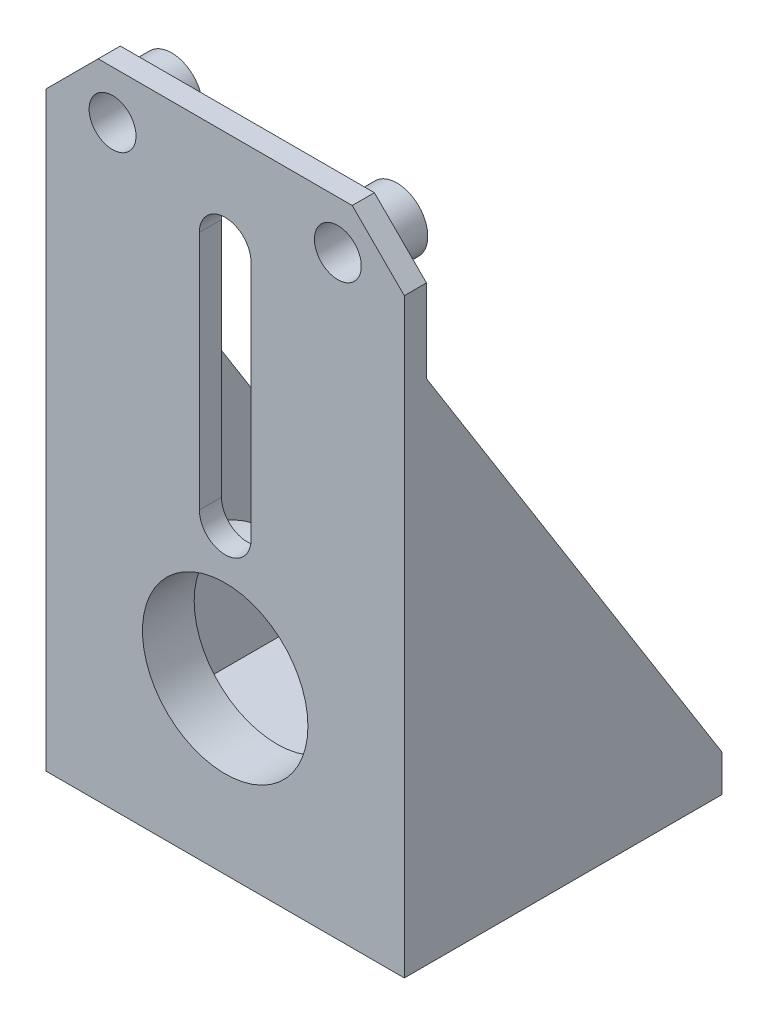
ISO-10303-21;
HEADER;
FILE_DESCRIPTION(('STEP AP214'),'2;1');
FILE_NAME('part.step','',(''),(''),'','','');
FILE_SCHEMA(('AUTOMOTIVE_DESIGN { 1 0 10303 214 1 1 1 1 }'));
ENDSEC;
DATA;
#1=APPLICATION_CONTEXT('core data for automotive mechanical design processes');
#2=APPLICATION_PROTOCOL_DEFINITION('international standard','automotive_design',2000,#1);
#3=PRODUCT_CONTEXT('',#1,'mechanical');
#4=PRODUCT('Part','Part','',(#3));
#5=PRODUCT_RELATED_PRODUCT_CATEGORY('part','',(#4));
#6=PRODUCT_DEFINITION_FORMATION('','',#4);
#7=PRODUCT_DEFINITION_CONTEXT('part definition',#1,'design');
#8=PRODUCT_DEFINITION('design','',#6,#7);
#9=PRODUCT_DEFINITION_SHAPE('','',#8);
#10=(LENGTH_UNIT() NAMED_UNIT(*) SI_UNIT(.MILLI.,.METRE.));
#11=(NAMED_UNIT(*) PLANE_ANGLE_UNIT() SI_UNIT($,.RADIAN.));
#12=(NAMED_UNIT(*) SI_UNIT($,.STERADIAN.) SOLID_ANGLE_UNIT());
#13=UNCERTAINTY_MEASURE_WITH_UNIT(LENGTH_MEASURE(1.E-05),#10,'distance_accuracy_value','');
#14=(GEOMETRIC_REPRESENTATION_CONTEXT(3) GLOBAL_UNCERTAINTY_ASSIGNED_CONTEXT((#13)) GLOBAL_UNIT_ASSIGNED_CONTEXT((#10,
#11,#12)) REPRESENTATION_CONTEXT('',''));
#15=CARTESIAN_POINT('',(0.,0.,0.));
#16=DIRECTION('',(0.,0.,1.));
#17=DIRECTION('',(1.,0.,0.));
#18=AXIS2_PLACEMENT_3D('',#15,#16,#17);
#19=CARTESIAN_POINT('',(0.,0.,0.));
#20=DIRECTION('',(0.,0.,-1.));
#21=DIRECTION('',(-1.,0.,0.));
#22=AXIS2_PLACEMENT_3D('',#19,#20,#21);
#23=PLANE('',#22);
#24=DIRECTION('',(0.,-1.,0.));
#25=VECTOR('',#24,1.);
#26=CARTESIAN_POINT('',(-36.4212863458922,72.55,0.));
#27=LINE('',#26,#25);
#28=CARTESIAN_POINT('',(-36.4212863458922,70.9996172150046,0.));
#29=VERTEX_POINT('',#28);
#30=CARTESIAN_POINT('',(-36.4212863458922,59.7674418604651,0.));
#31=VERTEX_POINT('',#30);
#32=EDGE_CURVE('E163',#29,#31,#27,.T.);
#33=ORIENTED_EDGE('',*,*,#32,.F.);
#34=DIRECTION('',(0.707106781186546,0.707106781186549,0.));
#35=VECTOR('',#34,1.);
#36=CARTESIAN_POINT('',(-53.7104517804485,53.7104517804483,0.));
#37=LINE('',#36,#35);
#38=CARTESIAN_POINT('',(-29.3709035608969,78.05,0.));
#39=VERTEX_POINT('',#38);
#40=EDGE_CURVE('E173',#29,#39,#37,.T.);
#41=ORIENTED_EDGE('',*,*,#40,.T.);
#42=DIRECTION('',(1.,0.,0.));
#43=VECTOR('',#42,1.);
#44=CARTESIAN_POINT('',(0.,78.05,0.));
#45=LINE('',#44,#43);
#46=CARTESIAN_POINT('',(5.02833086911244,78.05,0.));
#47=VERTEX_POINT('',#46);
#48=EDGE_CURVE('E177',#39,#47,#45,.T.);
#49=ORIENTED_EDGE('',*,*,#48,.T.);
#50=DIRECTION('',(-0.707106781186546,0.707106781186549,0.));
#51=VECTOR('',#50,1.);
#52=CARTESIAN_POINT('',(41.5391654345562,41.5391654345561,0.));
#53=LINE('',#52,#51);
#54=CARTESIAN_POINT('',(12.0787136541078,70.9996172150046,0.));
#55=VERTEX_POINT('',#54);
#56=EDGE_CURVE('E169',#55,#47,#53,.T.);
#57=ORIENTED_EDGE('',*,*,#56,.F.);
#58=DIRECTION('',(0.,1.,0.));
#59=VECTOR('',#58,1.);
#60=CARTESIAN_POINT('',(12.0787136541078,72.5556248805126,0.));
#61=LINE('',#60,#59);
#62=CARTESIAN_POINT('',(12.0787136541078,59.7674418604652,0.));
#63=VERTEX_POINT('',#62);
#64=EDGE_CURVE('E153',#63,#55,#61,.T.);
#65=ORIENTED_EDGE('',*,*,#64,.F.);
#66=DIRECTION('',(1.,0.,0.));
#67=VECTOR('',#66,1.);
#68=CARTESIAN_POINT('',(0.,59.7674418604651,0.));
#69=LINE('',#68,#67);
#70=CARTESIAN_POINT('',(9.07871365410777,59.7674418604651,0.));
#71=VERTEX_POINT('',#70);
#72=EDGE_CURVE('E164',#71,#63,#69,.T.);
#73=ORIENTED_EDGE('',*,*,#72,.F.);
#74=DIRECTION('',(0.,-1.,0.));
#75=VECTOR('',#74,1.);
#76=CARTESIAN_POINT('',(9.07871365410777,48.0313996107964,0.));
#77=LINE('',#76,#75);
#78=CARTESIAN_POINT('',(9.07871365410777,-6.00000000000001,0.));
#79=VERTEX_POINT('',#78);
#80=EDGE_CURVE('E285',#71,#79,#77,.T.);
#81=ORIENTED_EDGE('',*,*,#80,.T.);
#82=DIRECTION('',(1.,0.,0.));
#83=VECTOR('',#82,1.);
#84=CARTESIAN_POINT('',(9.07871365410777,-6.00000000000001,0.));
#85=LINE('',#84,#83);
#86=CARTESIAN_POINT('',(-33.4212863458922,-6.00000000000001,0.));
#87=VERTEX_POINT('',#86);
#88=EDGE_CURVE('E283',#87,#79,#85,.T.);
#89=ORIENTED_EDGE('',*,*,#88,.F.);
#90=DIRECTION('',(0.,1.,0.));
#91=VECTOR('',#90,1.);
#92=CARTESIAN_POINT('',(-33.4212863458922,48.0313996107964,0.));
#93=LINE('',#92,#91);
#94=CARTESIAN_POINT('',(-33.4212863458922,59.7674418604651,0.));
#95=VERTEX_POINT('',#94);
#96=EDGE_CURVE('E255',#87,#95,#93,.T.);
#97=ORIENTED_EDGE('',*,*,#96,.T.);
#98=DIRECTION('',(1.,0.,0.));
#99=VECTOR('',#98,1.);
#100=CARTESIAN_POINT('',(0.,59.7674418604651,0.));
#101=LINE('',#100,#99);
#102=EDGE_CURVE('E202',#31,#95,#101,.T.);
#103=ORIENTED_EDGE('',*,*,#102,.F.);
#104=EDGE_LOOP('',(#33,#41,#49,#57,#65,#73,#81,#89,#97,#103));
#105=FACE_BOUND('',#104,.T.);
#106=CARTESIAN_POINT('',(-27.4212863458922,71.55,0.));
#107=DIRECTION('',(0.,0.,-1.));
#108=DIRECTION('',(-1.,0.,0.));
#109=AXIS2_PLACEMENT_3D('',#106,#107,#108);
#110=CIRCLE('',#109,4.175);
#111=CARTESIAN_POINT('',(-31.5962863458922,71.55,0.));
#112=VERTEX_POINT('',#111);
#113=EDGE_CURVE('E269',#112,#112,#110,.T.);
#114=ORIENTED_EDGE('',*,*,#113,.F.);
#115=EDGE_LOOP('',(#114));
#116=FACE_BOUND('',#115,.T.);
#117=CARTESIAN_POINT('',(3.07871365410777,71.55,0.));
#118=DIRECTION('',(0.,0.,-1.));
#119=DIRECTION('',(-1.,0.,0.));
#120=AXIS2_PLACEMENT_3D('',#117,#118,#119);
#121=CIRCLE('',#120,4.175);
#122=CARTESIAN_POINT('',(-1.09628634589223,71.55,0.));
#123=VERTEX_POINT('',#122);
#124=EDGE_CURVE('E272',#123,#123,#121,.T.);
#125=ORIENTED_EDGE('',*,*,#124,.F.);
#126=EDGE_LOOP('',(#125));
#127=FACE_BOUND('',#126,.T.);
#128=CARTESIAN_POINT('',(-12.1712863458922,64.55,0.));
#129=DIRECTION('',(0.,0.,-1.));
#130=DIRECTION('',(-1.,0.,0.));
#131=AXIS2_PLACEMENT_3D('',#128,#129,#130);
#132=CIRCLE('',#131,3.5);
#133=CARTESIAN_POINT('',(-15.6712863458922,64.55,0.));
#134=VERTEX_POINT('',#133);
#135=CARTESIAN_POINT('',(-8.67128634589223,64.55,0.));
#136=VERTEX_POINT('',#135);
#137=EDGE_CURVE('E250',#134,#136,#132,.T.);
#138=ORIENTED_EDGE('',*,*,#137,.F.);
#139=DIRECTION('',(0.,1.,0.));
#140=VECTOR('',#139,1.);
#141=CARTESIAN_POINT('',(-15.6712863458922,0.,0.));
#142=LINE('',#141,#140);
#143=CARTESIAN_POINT('',(-15.6712863458922,32.,0.));
#144=VERTEX_POINT('',#143);
#145=EDGE_CURVE('E240',#144,#134,#142,.T.);
#146=ORIENTED_EDGE('',*,*,#145,.F.);
#147=CARTESIAN_POINT('',(-12.1712863458922,32.,0.));
#148=DIRECTION('',(0.,0.,-1.));
#149=DIRECTION('',(-1.,0.,0.));
#150=AXIS2_PLACEMENT_3D('',#147,#148,#149);
#151=CIRCLE('',#150,3.5);
#152=CARTESIAN_POINT('',(-8.67128634589223,32.,0.));
#153=VERTEX_POINT('',#152);
#154=EDGE_CURVE('E246',#153,#144,#151,.T.);
#155=ORIENTED_EDGE('',*,*,#154,.F.);
#156=DIRECTION('',(0.,-1.,0.));
#157=VECTOR('',#156,1.);
#158=CARTESIAN_POINT('',(-8.67128634589223,0.,0.));
#159=LINE('',#158,#157);
#160=EDGE_CURVE('E248',#136,#153,#159,.T.);
#161=ORIENTED_EDGE('',*,*,#160,.F.);
#162=EDGE_LOOP('',(#138,#146,#155,#161));
#163=FACE_BOUND('',#162,.T.);
#164=CARTESIAN_POINT('',(-12.1712863458922,14.,0.));
#165=DIRECTION('',(0.,0.,-1.));
#166=DIRECTION('',(-1.,0.,0.));
#167=AXIS2_PLACEMENT_3D('',#164,#165,#166);
#168=CIRCLE('',#167,13.5);
#169=CARTESIAN_POINT('',(-25.6712863458922,14.,0.));
#170=VERTEX_POINT('',#169);
#171=EDGE_CURVE('E222',#170,#170,#168,.T.);
#172=ORIENTED_EDGE('',*,*,#171,.F.);
#173=EDGE_LOOP('',(#172));
#174=FACE_BOUND('',#173,.T.);
#175=ADVANCED_FACE('F37',(#105,#116,#127,#163,#174),#23,.T.);
#176=CARTESIAN_POINT('',(-36.2590086857239,-9.00000000000001,3.));
#177=DIRECTION('',(0.,-1.,0.));
#178=DIRECTION('',(0.,0.,-1.));
#179=AXIS2_PLACEMENT_3D('',#176,#177,#178);
#180=PLANE('',#179);
#181=DIRECTION('',(-1.,0.,0.));
#182=VECTOR('',#181,1.);
#183=CARTESIAN_POINT('',(12.0787136541078,-9.00000000000001,3.));
#184=LINE('',#183,#182);
#185=CARTESIAN_POINT('',(12.0787136541078,-9.00000000000001,3.));
#186=VERTEX_POINT('',#185);
#187=CARTESIAN_POINT('',(-36.4212863458922,-9.00000000000001,3.));
#188=VERTEX_POINT('',#187);
#189=EDGE_CURVE('E306',#186,#188,#184,.T.);
#190=ORIENTED_EDGE('',*,*,#189,.T.);
#191=DIRECTION('',(0.,0.,1.));
#192=VECTOR('',#191,1.);
#193=CARTESIAN_POINT('',(-36.4212863458922,-9.00000000000001,-40.));
#194=LINE('',#193,#192);
#195=CARTESIAN_POINT('',(-36.4212863458922,-9.00000000000001,-40.));
#196=VERTEX_POINT('',#195);
#197=EDGE_CURVE('E203',#196,#188,#194,.T.);
#198=ORIENTED_EDGE('',*,*,#197,.F.);
#199=DIRECTION('',(-1.,0.,0.));
#200=VECTOR('',#199,1.);
#201=CARTESIAN_POINT('',(12.0787136541078,-9.00000000000001,-40.));
#202=LINE('',#201,#200);
#203=CARTESIAN_POINT('',(12.0787136541078,-9.00000000000001,-40.));
#204=VERTEX_POINT('',#203);
#205=EDGE_CURVE('E299',#204,#196,#202,.T.);
#206=ORIENTED_EDGE('',*,*,#205,.F.);
#207=DIRECTION('',(0.,0.,-1.));
#208=VECTOR('',#207,1.);
#209=CARTESIAN_POINT('',(12.0787136541078,-9.00000000000001,3.));
#210=LINE('',#209,#208);
#211=EDGE_CURVE('E11',#186,#204,#210,.T.);
#212=ORIENTED_EDGE('',*,*,#211,.F.);
#213=EDGE_LOOP('',(#190,#198,#206,#212));
#214=FACE_BOUND('',#213,.T.);
#215=ADVANCED_FACE('F333',(#214),#180,.T.);
#216=CARTESIAN_POINT('',(12.0787136541078,-4.00000000000001,3.));
#217=DIRECTION('',(1.,0.,0.));
#218=DIRECTION('',(0.,0.,-1.));
#219=AXIS2_PLACEMENT_3D('',#216,#217,#218);
#220=PLANE('',#219);
#221=ORIENTED_EDGE('',*,*,#64,.T.);
#222=DIRECTION('',(0.,0.,1.));
#223=VECTOR('',#222,1.);
#224=CARTESIAN_POINT('',(12.0787136541078,70.9996172150046,0.));
#225=LINE('',#224,#223);
#226=CARTESIAN_POINT('',(12.0787136541078,70.9996172150046,3.));
#227=VERTEX_POINT('',#226);
#228=EDGE_CURVE('E156',#55,#227,#225,.T.);
#229=ORIENTED_EDGE('',*,*,#228,.T.);
#230=DIRECTION('',(0.,-1.,0.));
#231=VECTOR('',#230,1.);
#232=CARTESIAN_POINT('',(12.0787136541078,-4.00000000000001,3.));
#233=LINE('',#232,#231);
#234=EDGE_CURVE('E304',#227,#186,#233,.T.);
#235=ORIENTED_EDGE('',*,*,#234,.T.);
#236=ORIENTED_EDGE('',*,*,#211,.T.);
#237=DIRECTION('',(0.,-1.,0.));
#238=VECTOR('',#237,1.);
#239=CARTESIAN_POINT('',(12.0787136541078,-4.00000000000001,-40.));
#240=LINE('',#239,#238);
#241=CARTESIAN_POINT('',(12.0787136541078,-4.00000000000001,-40.));
#242=VERTEX_POINT('',#241);
#243=EDGE_CURVE('E296',#242,#204,#240,.T.);
#244=ORIENTED_EDGE('',*,*,#243,.F.);
#245=DIRECTION('',(0.,0.847129341977914,0.531386749891325));
#246=VECTOR('',#245,1.);
#247=CARTESIAN_POINT('',(12.0787136541078,-4.00000000000001,-40.));
#248=LINE('',#247,#246);
#249=EDGE_CURVE('E159',#242,#63,#248,.T.);
#250=ORIENTED_EDGE('',*,*,#249,.T.);
#251=EDGE_LOOP('',(#221,#229,#235,#236,#244,#250));
#252=FACE_BOUND('',#251,.T.);
#253=ADVANCED_FACE('F155',(#252),#220,.T.);
#254=CARTESIAN_POINT('',(9.07871365410777,-6.00000000000001,3.));
#255=DIRECTION('',(-1.,0.,0.));
#256=DIRECTION('',(0.,0.,1.));
#257=AXIS2_PLACEMENT_3D('',#254,#255,#256);
#258=PLANE('',#257);
#259=DIRECTION('',(0.,0.,-1.));
#260=VECTOR('',#259,1.);
#261=CARTESIAN_POINT('',(9.07871365410777,-6.00000000000001,3.));
#262=LINE('',#261,#260);
#263=CARTESIAN_POINT('',(9.07871365410777,-6.00000000000001,-40.));
#264=VERTEX_POINT('',#263);
#265=EDGE_CURVE('E46',#79,#264,#262,.T.);
#266=ORIENTED_EDGE('',*,*,#265,.F.);
#267=ORIENTED_EDGE('',*,*,#80,.F.);
#268=DIRECTION('',(0.,0.847129341977914,0.531386749891325));
#269=VECTOR('',#268,1.);
#270=CARTESIAN_POINT('',(9.07871365410777,-4.00000000000001,-40.));
#271=LINE('',#270,#269);
#272=CARTESIAN_POINT('',(9.07871365410777,-4.00000000000001,-40.));
#273=VERTEX_POINT('',#272);
#274=EDGE_CURVE('E213',#273,#71,#271,.T.);
#275=ORIENTED_EDGE('',*,*,#274,.F.);
#276=DIRECTION('',(0.,1.,0.));
#277=VECTOR('',#276,1.);
#278=CARTESIAN_POINT('',(9.07871365410777,-6.00000000000001,-40.));
#279=LINE('',#278,#277);
#280=EDGE_CURVE('E290',#264,#273,#279,.T.);
#281=ORIENTED_EDGE('',*,*,#280,.F.);
#282=EDGE_LOOP('',(#266,#267,#275,#281));
#283=FACE_BOUND('',#282,.T.);
#284=ADVANCED_FACE('F324',(#283),#258,.T.);
#285=CARTESIAN_POINT('',(-33.4212863458922,-6.00000000000001,3.));
#286=DIRECTION('',(0.,1.,0.));
#287=DIRECTION('',(-1.,0.,0.));
#288=AXIS2_PLACEMENT_3D('',#285,#286,#287);
#289=PLANE('',#288);
#290=ORIENTED_EDGE('',*,*,#265,.T.);
#291=DIRECTION('',(1.,0.,0.));
#292=VECTOR('',#291,1.);
#293=CARTESIAN_POINT('',(-33.4212863458922,-6.00000000000001,-40.));
#294=LINE('',#293,#292);
#295=CARTESIAN_POINT('',(-33.4212863458922,-6.00000000000001,-40.));
#296=VERTEX_POINT('',#295);
#297=EDGE_CURVE('E288',#296,#264,#294,.T.);
#298=ORIENTED_EDGE('',*,*,#297,.F.);
#299=DIRECTION('',(0.,0.,-1.));
#300=VECTOR('',#299,1.);
#301=CARTESIAN_POINT('',(-33.4212863458922,-6.00000000000001,3.));
#302=LINE('',#301,#300);
#303=EDGE_CURVE('E41',#87,#296,#302,.T.);
#304=ORIENTED_EDGE('',*,*,#303,.F.);
#305=ORIENTED_EDGE('',*,*,#88,.T.);
#306=EDGE_LOOP('',(#290,#298,#304,#305));
#307=FACE_BOUND('',#306,.T.);
#308=ADVANCED_FACE('F39',(#307),#289,.T.);
#309=CARTESIAN_POINT('',(0.,0.,3.));
#310=DIRECTION('',(0.,0.,1.));
#311=DIRECTION('',(1.,0.,0.));
#312=AXIS2_PLACEMENT_3D('',#309,#310,#311);
#313=PLANE('',#312);
#314=DIRECTION('',(0.707106781186546,0.707106781186549,0.));
#315=VECTOR('',#314,1.);
#316=CARTESIAN_POINT('',(-53.7104517804485,53.7104517804483,3.));
#317=LINE('',#316,#315);
#318=CARTESIAN_POINT('',(-36.4212863458922,70.9996172150046,3.));
#319=VERTEX_POINT('',#318);
#320=CARTESIAN_POINT('',(-29.3709035608969,78.05,3.));
#321=VERTEX_POINT('',#320);
#322=EDGE_CURVE('E179',#319,#321,#317,.T.);
#323=ORIENTED_EDGE('',*,*,#322,.F.);
#324=DIRECTION('',(0.,-1.,0.));
#325=VECTOR('',#324,1.);
#326=CARTESIAN_POINT('',(-36.4212863458922,48.0313996107964,3.));
#327=LINE('',#326,#325);
#328=EDGE_CURVE('E257',#319,#188,#327,.T.);
#329=ORIENTED_EDGE('',*,*,#328,.T.);
#330=ORIENTED_EDGE('',*,*,#189,.F.);
#331=ORIENTED_EDGE('',*,*,#234,.F.);
#332=DIRECTION('',(-0.707106781186546,0.707106781186549,0.));
#333=VECTOR('',#332,1.);
#334=CARTESIAN_POINT('',(41.5391654345562,41.5391654345561,3.));
#335=LINE('',#334,#333);
#336=CARTESIAN_POINT('',(5.02833086911244,78.05,3.));
#337=VERTEX_POINT('',#336);
#338=EDGE_CURVE('E171',#227,#337,#335,.T.);
#339=ORIENTED_EDGE('',*,*,#338,.T.);
#340=DIRECTION('',(1.,0.,0.));
#341=VECTOR('',#340,1.);
#342=CARTESIAN_POINT('',(0.,78.05,3.));
#343=LINE('',#342,#341);
#344=EDGE_CURVE('E182',#321,#337,#343,.T.);
#345=ORIENTED_EDGE('',*,*,#344,.F.);
#346=EDGE_LOOP('',(#323,#329,#330,#331,#339,#345));
#347=FACE_BOUND('',#346,.T.);
#348=CARTESIAN_POINT('',(-12.1712863458922,64.55,3.));
#349=DIRECTION('',(0.,0.,1.));
#350=DIRECTION('',(1.,0.,0.));
#351=AXIS2_PLACEMENT_3D('',#348,#349,#350);
#352=CIRCLE('',#351,3.5);
#353=CARTESIAN_POINT('',(-8.67128634589223,64.55,3.));
#354=VERTEX_POINT('',#353);
#355=CARTESIAN_POINT('',(-15.6712863458922,64.55,3.));
#356=VERTEX_POINT('',#355);
#357=EDGE_CURVE('E62',#354,#356,#352,.T.);
#358=ORIENTED_EDGE('',*,*,#357,.F.);
#359=DIRECTION('',(0.,1.,0.));
#360=VECTOR('',#359,1.);
#361=CARTESIAN_POINT('',(-8.67128634589223,64.55,3.));
#362=LINE('',#361,#360);
#363=CARTESIAN_POINT('',(-8.67128634589223,32.,3.));
#364=VERTEX_POINT('',#363);
#365=EDGE_CURVE('E234',#364,#354,#362,.T.);
#366=ORIENTED_EDGE('',*,*,#365,.F.);
#367=CARTESIAN_POINT('',(-12.1712863458922,32.,3.));
#368=DIRECTION('',(0.,0.,1.));
#369=DIRECTION('',(1.,0.,0.));
#370=AXIS2_PLACEMENT_3D('',#367,#368,#369);
#371=CIRCLE('',#370,3.5);
#372=CARTESIAN_POINT('',(-15.6712863458922,32.,3.));
#373=VERTEX_POINT('',#372);
#374=EDGE_CURVE('E231',#373,#364,#371,.T.);
#375=ORIENTED_EDGE('',*,*,#374,.F.);
#376=DIRECTION('',(0.,-1.,0.));
#377=VECTOR('',#376,1.);
#378=CARTESIAN_POINT('',(-15.6712863458922,64.55,3.));
#379=LINE('',#378,#377);
#380=EDGE_CURVE('E229',#356,#373,#379,.T.);
#381=ORIENTED_EDGE('',*,*,#380,.F.);
#382=EDGE_LOOP('',(#358,#366,#375,#381));
#383=FACE_BOUND('',#382,.T.);
#384=CARTESIAN_POINT('',(-12.1712863458922,14.,3.));
#385=DIRECTION('',(0.,0.,1.));
#386=DIRECTION('',(1.,0.,0.));
#387=AXIS2_PLACEMENT_3D('',#384,#385,#386);
#388=CIRCLE('',#387,11.2);
#389=CARTESIAN_POINT('',(-0.971286345892228,14.,3.));
#390=VERTEX_POINT('',#389);
#391=EDGE_CURVE('E252',#390,#390,#388,.T.);
#392=ORIENTED_EDGE('',*,*,#391,.F.);
#393=EDGE_LOOP('',(#392));
#394=FACE_BOUND('',#393,.T.);
#395=CARTESIAN_POINT('',(-27.4212863458922,71.55,3.));
#396=DIRECTION('',(0.,0.,1.));
#397=DIRECTION('',(1.,0.,0.));
#398=AXIS2_PLACEMENT_3D('',#395,#396,#397);
#399=CIRCLE('',#398,3.175);
#400=CARTESIAN_POINT('',(-24.2462863458922,71.55,3.));
#401=VERTEX_POINT('',#400);
#402=EDGE_CURVE('E280',#401,#401,#399,.T.);
#403=ORIENTED_EDGE('',*,*,#402,.F.);
#404=EDGE_LOOP('',(#403));
#405=FACE_BOUND('',#404,.T.);
#406=CARTESIAN_POINT('',(3.07871365410777,71.55,3.));
#407=DIRECTION('',(0.,0.,1.));
#408=DIRECTION('',(-1.,0.,0.));
#409=AXIS2_PLACEMENT_3D('',#406,#407,#408);
#410=CIRCLE('',#409,3.175);
#411=CARTESIAN_POINT('',(-0.0962863458922273,71.55,3.));
#412=VERTEX_POINT('',#411);
#413=EDGE_CURVE('E277',#412,#412,#410,.T.);
#414=ORIENTED_EDGE('',*,*,#413,.F.);
#415=EDGE_LOOP('',(#414));
#416=FACE_BOUND('',#415,.T.);
#417=ADVANCED_FACE('F323',(#347,#383,#394,#405,#416),#313,.T.);
#418=CARTESIAN_POINT('',(0.,0.,-40.));
#419=DIRECTION('',(0.,0.,1.));
#420=DIRECTION('',(1.,0.,0.));
#421=AXIS2_PLACEMENT_3D('',#418,#419,#420);
#422=PLANE('',#421);
#423=DIRECTION('',(1.,0.,0.));
#424=VECTOR('',#423,1.);
#425=CARTESIAN_POINT('',(-33.2590086857238,-4.00000000000001,-40.));
#426=LINE('',#425,#424);
#427=CARTESIAN_POINT('',(-36.4212863458922,-4.00000000000001,-40.));
#428=VERTEX_POINT('',#427);
#429=CARTESIAN_POINT('',(-33.4212863458922,-4.00000000000001,-40.));
#430=VERTEX_POINT('',#429);
#431=EDGE_CURVE('E301',#428,#430,#426,.T.);
#432=ORIENTED_EDGE('',*,*,#431,.T.);
#433=DIRECTION('',(0.,1.,0.));
#434=VECTOR('',#433,1.);
#435=CARTESIAN_POINT('',(-33.4212863458922,-6.00000000000001,-40.));
#436=LINE('',#435,#434);
#437=EDGE_CURVE('E192',#296,#430,#436,.T.);
#438=ORIENTED_EDGE('',*,*,#437,.F.);
#439=ORIENTED_EDGE('',*,*,#297,.T.);
#440=ORIENTED_EDGE('',*,*,#280,.T.);
#441=DIRECTION('',(1.,0.,0.));
#442=VECTOR('',#441,1.);
#443=CARTESIAN_POINT('',(9.07871365410777,-4.00000000000001,-40.));
#444=LINE('',#443,#442);
#445=EDGE_CURVE('E293',#273,#242,#444,.T.);
#446=ORIENTED_EDGE('',*,*,#445,.T.);
#447=ORIENTED_EDGE('',*,*,#243,.T.);
#448=ORIENTED_EDGE('',*,*,#205,.T.);
#449=DIRECTION('',(0.,-1.,0.));
#450=VECTOR('',#449,1.);
#451=CARTESIAN_POINT('',(-36.4212863458922,-4.00000000000001,-40.));
#452=LINE('',#451,#450);
#453=EDGE_CURVE('E206',#428,#196,#452,.T.);
#454=ORIENTED_EDGE('',*,*,#453,.F.);
#455=EDGE_LOOP('',(#432,#438,#439,#440,#446,#447,#448,#454));
#456=FACE_BOUND('',#455,.T.);
#457=ADVANCED_FACE('F320',(#456),#422,.F.);
#458=CARTESIAN_POINT('',(-27.4212863458922,71.55,3.));
#459=DIRECTION('',(0.,0.,-1.));
#460=DIRECTION('',(-1.,0.,0.));
#461=AXIS2_PLACEMENT_3D('',#458,#459,#460);
#462=CYLINDRICAL_SURFACE('',#461,3.175);
#463=ORIENTED_EDGE('',*,*,#402,.T.);
#464=EDGE_LOOP('',(#463));
#465=FACE_BOUND('',#464,.T.);
#466=CARTESIAN_POINT('',(-27.4212863458922,71.55,-3.));
#467=DIRECTION('',(0.,0.,-1.));
#468=DIRECTION('',(-1.,0.,0.));
#469=AXIS2_PLACEMENT_3D('',#466,#467,#468);
#470=CIRCLE('',#469,3.175);
#471=CARTESIAN_POINT('',(-30.5962863458922,71.55,-3.));
#472=VERTEX_POINT('',#471);
#473=EDGE_CURVE('E262',#472,#472,#470,.T.);
#474=ORIENTED_EDGE('',*,*,#473,.T.);
#475=EDGE_LOOP('',(#474));
#476=FACE_BOUND('',#475,.T.);
#477=ADVANCED_FACE('F342',(#465,#476),#462,.F.);
#478=CARTESIAN_POINT('',(3.07871365410777,71.55,3.));
#479=DIRECTION('',(0.,0.,-1.));
#480=DIRECTION('',(-1.,0.,0.));
#481=AXIS2_PLACEMENT_3D('',#478,#479,#480);
#482=CYLINDRICAL_SURFACE('',#481,3.175);
#483=ORIENTED_EDGE('',*,*,#413,.T.);
#484=EDGE_LOOP('',(#483));
#485=FACE_BOUND('',#484,.T.);
#486=CARTESIAN_POINT('',(3.07871365410777,71.55,-3.));
#487=DIRECTION('',(0.,0.,-1.));
#488=DIRECTION('',(-1.,0.,0.));
#489=AXIS2_PLACEMENT_3D('',#486,#487,#488);
#490=CIRCLE('',#489,3.175);
#491=CARTESIAN_POINT('',(-0.0962863458922273,71.55,-3.));
#492=VERTEX_POINT('',#491);
#493=EDGE_CURVE('E266',#492,#492,#490,.T.);
#494=ORIENTED_EDGE('',*,*,#493,.T.);
#495=EDGE_LOOP('',(#494));
#496=FACE_BOUND('',#495,.T.);
#497=ADVANCED_FACE('F528',(#485,#496),#482,.F.);
#498=CARTESIAN_POINT('',(3.07871365410777,71.55,-3.));
#499=DIRECTION('',(0.,0.,1.));
#500=DIRECTION('',(1.,0.,0.));
#501=AXIS2_PLACEMENT_3D('',#498,#499,#500);
#502=CYLINDRICAL_SURFACE('',#501,4.175);
#503=ORIENTED_EDGE('',*,*,#124,.T.);
#504=EDGE_LOOP('',(#503));
#505=FACE_BOUND('',#504,.T.);
#506=CARTESIAN_POINT('',(3.07871365410777,71.55,-5.));
#507=DIRECTION('',(0.,0.,-1.));
#508=DIRECTION('',(-1.,0.,0.));
#509=AXIS2_PLACEMENT_3D('',#506,#507,#508);
#510=CIRCLE('',#509,4.175);
#511=CARTESIAN_POINT('',(-1.09628634589223,71.55,-5.));
#512=VERTEX_POINT('',#511);
#513=EDGE_CURVE('E263',#512,#512,#510,.T.);
#514=ORIENTED_EDGE('',*,*,#513,.F.);
#515=EDGE_LOOP('',(#514));
#516=FACE_BOUND('',#515,.T.);
#517=ADVANCED_FACE('F525',(#505,#516),#502,.T.);
#518=CARTESIAN_POINT('',(-27.4212863458922,71.55,-3.));
#519=DIRECTION('',(0.,0.,1.));
#520=DIRECTION('',(1.,0.,0.));
#521=AXIS2_PLACEMENT_3D('',#518,#519,#520);
#522=CYLINDRICAL_SURFACE('',#521,4.175);
#523=ORIENTED_EDGE('',*,*,#113,.T.);
#524=EDGE_LOOP('',(#523));
#525=FACE_BOUND('',#524,.T.);
#526=CARTESIAN_POINT('',(-27.4212863458922,71.55,-5.));
#527=DIRECTION('',(0.,0.,-1.));
#528=DIRECTION('',(-1.,0.,0.));
#529=AXIS2_PLACEMENT_3D('',#526,#527,#528);
#530=CIRCLE('',#529,4.175);
#531=CARTESIAN_POINT('',(-31.5962863458922,71.55,-5.));
#532=VERTEX_POINT('',#531);
#533=EDGE_CURVE('E259',#532,#532,#530,.T.);
#534=ORIENTED_EDGE('',*,*,#533,.F.);
#535=EDGE_LOOP('',(#534));
#536=FACE_BOUND('',#535,.T.);
#537=ADVANCED_FACE('F521',(#525,#536),#522,.T.);
#538=CARTESIAN_POINT('',(3.07871365410777,71.55,-3.));
#539=DIRECTION('',(0.,0.,-1.));
#540=DIRECTION('',(-1.,0.,0.));
#541=AXIS2_PLACEMENT_3D('',#538,#539,#540);
#542=PLANE('',#541);
#543=ORIENTED_EDGE('',*,*,#493,.F.);
#544=EDGE_LOOP('',(#543));
#545=FACE_BOUND('',#544,.T.);
#546=ADVANCED_FACE('F517',(#545),#542,.F.);
#547=CARTESIAN_POINT('',(3.07871365410777,71.55,-5.));
#548=DIRECTION('',(0.,0.,-1.));
#549=DIRECTION('',(-1.,0.,0.));
#550=AXIS2_PLACEMENT_3D('',#547,#548,#549);
#551=PLANE('',#550);
#552=ORIENTED_EDGE('',*,*,#513,.T.);
#553=EDGE_LOOP('',(#552));
#554=FACE_BOUND('',#553,.T.);
#555=ADVANCED_FACE('F513',(#554),#551,.T.);
#556=CARTESIAN_POINT('',(-27.4212863458922,71.55,-3.));
#557=DIRECTION('',(0.,0.,-1.));
#558=DIRECTION('',(-1.,0.,0.));
#559=AXIS2_PLACEMENT_3D('',#556,#557,#558);
#560=PLANE('',#559);
#561=ORIENTED_EDGE('',*,*,#473,.F.);
#562=EDGE_LOOP('',(#561));
#563=FACE_BOUND('',#562,.T.);
#564=ADVANCED_FACE('F509',(#563),#560,.F.);
#565=CARTESIAN_POINT('',(-27.4212863458922,71.55,-5.));
#566=DIRECTION('',(0.,0.,-1.));
#567=DIRECTION('',(-1.,0.,0.));
#568=AXIS2_PLACEMENT_3D('',#565,#566,#567);
#569=PLANE('',#568);
#570=ORIENTED_EDGE('',*,*,#533,.T.);
#571=EDGE_LOOP('',(#570));
#572=FACE_BOUND('',#571,.T.);
#573=ADVANCED_FACE('F453',(#572),#569,.T.);
#574=CARTESIAN_POINT('',(-36.4212863458922,48.0313996107964,0.));
#575=DIRECTION('',(-1.,0.,0.));
#576=DIRECTION('',(0.,0.,1.));
#577=AXIS2_PLACEMENT_3D('',#574,#575,#576);
#578=PLANE('',#577);
#579=ORIENTED_EDGE('',*,*,#328,.F.);
#580=DIRECTION('',(0.,0.,1.));
#581=VECTOR('',#580,1.);
#582=CARTESIAN_POINT('',(-36.4212863458922,70.9996172150046,0.));
#583=LINE('',#582,#581);
#584=EDGE_CURVE('E189',#29,#319,#583,.T.);
#585=ORIENTED_EDGE('',*,*,#584,.F.);
#586=ORIENTED_EDGE('',*,*,#32,.T.);
#587=DIRECTION('',(0.,-0.847129341977914,-0.531386749891325));
#588=VECTOR('',#587,1.);
#589=CARTESIAN_POINT('',(-36.4212863458922,64.55,3.));
#590=LINE('',#589,#588);
#591=EDGE_CURVE('E198',#31,#428,#590,.T.);
#592=ORIENTED_EDGE('',*,*,#591,.T.);
#593=ORIENTED_EDGE('',*,*,#453,.T.);
#594=ORIENTED_EDGE('',*,*,#197,.T.);
#595=EDGE_LOOP('',(#579,#585,#586,#592,#593,#594));
#596=FACE_BOUND('',#595,.T.);
#597=ADVANCED_FACE('F407',(#596),#578,.T.);
#598=CARTESIAN_POINT('',(-33.4212863458922,0.,0.));
#599=DIRECTION('',(-1.,0.,0.));
#600=DIRECTION('',(0.,0.,1.));
#601=AXIS2_PLACEMENT_3D('',#598,#599,#600);
#602=PLANE('',#601);
#603=ORIENTED_EDGE('',*,*,#96,.F.);
#604=ORIENTED_EDGE('',*,*,#303,.T.);
#605=ORIENTED_EDGE('',*,*,#437,.T.);
#606=DIRECTION('',(0.,-0.847129341977914,-0.531386749891325));
#607=VECTOR('',#606,1.);
#608=CARTESIAN_POINT('',(-33.4212863458922,64.55,3.));
#609=LINE('',#608,#607);
#610=EDGE_CURVE('E199',#95,#430,#609,.T.);
#611=ORIENTED_EDGE('',*,*,#610,.F.);
#612=EDGE_LOOP('',(#603,#604,#605,#611));
#613=FACE_BOUND('',#612,.T.);
#614=ADVANCED_FACE('F316',(#613),#602,.F.);
#615=CARTESIAN_POINT('',(-12.1712863458922,14.,-19.7));
#616=DIRECTION('',(0.,0.,1.));
#617=DIRECTION('',(1.,0.,0.));
#618=AXIS2_PLACEMENT_3D('',#615,#616,#617);
#619=CYLINDRICAL_SURFACE('',#618,11.2);
#620=ORIENTED_EDGE('',*,*,#391,.T.);
#621=EDGE_LOOP('',(#620));
#622=FACE_BOUND('',#621,.T.);
#623=CARTESIAN_POINT('',(-12.1712863458922,14.,-4.));
#624=DIRECTION('',(0.,0.,-1.));
#625=DIRECTION('',(-1.,0.,0.));
#626=AXIS2_PLACEMENT_3D('',#623,#624,#625);
#627=CIRCLE('',#626,11.2);
#628=CARTESIAN_POINT('',(-23.3712863458922,14.,-4.));
#629=VERTEX_POINT('',#628);
#630=EDGE_CURVE('E219',#629,#629,#627,.T.);
#631=ORIENTED_EDGE('',*,*,#630,.T.);
#632=EDGE_LOOP('',(#631));
#633=FACE_BOUND('',#632,.T.);
#634=ADVANCED_FACE('F406',(#622,#633),#619,.F.);
#635=CARTESIAN_POINT('',(-12.1712863458922,64.55,-7.));
#636=DIRECTION('',(0.,0.,1.));
#637=DIRECTION('',(1.,0.,0.));
#638=AXIS2_PLACEMENT_3D('',#635,#636,#637);
#639=CYLINDRICAL_SURFACE('',#638,3.5);
#640=ORIENTED_EDGE('',*,*,#137,.T.);
#641=DIRECTION('',(0.,0.,1.));
#642=VECTOR('',#641,1.);
#643=CARTESIAN_POINT('',(-8.67128634589223,64.55,-7.));
#644=LINE('',#643,#642);
#645=EDGE_CURVE('E238',#136,#354,#644,.T.);
#646=ORIENTED_EDGE('',*,*,#645,.T.);
#647=ORIENTED_EDGE('',*,*,#357,.T.);
#648=DIRECTION('',(0.,0.,1.));
#649=VECTOR('',#648,1.);
#650=CARTESIAN_POINT('',(-15.6712863458922,64.55,-7.));
#651=LINE('',#650,#649);
#652=EDGE_CURVE('E237',#134,#356,#651,.T.);
#653=ORIENTED_EDGE('',*,*,#652,.F.);
#654=EDGE_LOOP('',(#640,#646,#647,#653));
#655=FACE_BOUND('',#654,.T.);
#656=ADVANCED_FACE('F496',(#655),#639,.F.);
#657=CARTESIAN_POINT('',(-8.67128634589223,64.55,-7.));
#658=DIRECTION('',(1.,0.,0.));
#659=DIRECTION('',(0.,0.,-1.));
#660=AXIS2_PLACEMENT_3D('',#657,#658,#659);
#661=PLANE('',#660);
#662=ORIENTED_EDGE('',*,*,#160,.T.);
#663=DIRECTION('',(0.,0.,1.));
#664=VECTOR('',#663,1.);
#665=CARTESIAN_POINT('',(-8.67128634589223,32.,-7.));
#666=LINE('',#665,#664);
#667=EDGE_CURVE('E241',#153,#364,#666,.T.);
#668=ORIENTED_EDGE('',*,*,#667,.T.);
#669=ORIENTED_EDGE('',*,*,#365,.T.);
#670=ORIENTED_EDGE('',*,*,#645,.F.);
#671=EDGE_LOOP('',(#662,#668,#669,#670));
#672=FACE_BOUND('',#671,.T.);
#673=ADVANCED_FACE('F492',(#672),#661,.F.);
#674=CARTESIAN_POINT('',(-12.1712863458922,32.,-7.));
#675=DIRECTION('',(0.,0.,1.));
#676=DIRECTION('',(1.,0.,0.));
#677=AXIS2_PLACEMENT_3D('',#674,#675,#676);
#678=CYLINDRICAL_SURFACE('',#677,3.5);
#679=ORIENTED_EDGE('',*,*,#154,.T.);
#680=DIRECTION('',(0.,0.,1.));
#681=VECTOR('',#680,1.);
#682=CARTESIAN_POINT('',(-15.6712863458922,32.,-7.));
#683=LINE('',#682,#681);
#684=EDGE_CURVE('E54',#144,#373,#683,.T.);
#685=ORIENTED_EDGE('',*,*,#684,.T.);
#686=ORIENTED_EDGE('',*,*,#374,.T.);
#687=ORIENTED_EDGE('',*,*,#667,.F.);
#688=EDGE_LOOP('',(#679,#685,#686,#687));
#689=FACE_BOUND('',#688,.T.);
#690=ADVANCED_FACE('F495',(#689),#678,.F.);
#691=CARTESIAN_POINT('',(-15.6712863458922,64.55,-7.));
#692=DIRECTION('',(-1.,0.,0.));
#693=DIRECTION('',(0.,-1.,0.));
#694=AXIS2_PLACEMENT_3D('',#691,#692,#693);
#695=PLANE('',#694);
#696=ORIENTED_EDGE('',*,*,#145,.T.);
#697=ORIENTED_EDGE('',*,*,#652,.T.);
#698=ORIENTED_EDGE('',*,*,#380,.T.);
#699=ORIENTED_EDGE('',*,*,#684,.F.);
#700=EDGE_LOOP('',(#696,#697,#698,#699));
#701=FACE_BOUND('',#700,.T.);
#702=ADVANCED_FACE('F488',(#701),#695,.F.);
#703=CARTESIAN_POINT('',(-12.1712863458922,14.,-4.));
#704=DIRECTION('',(0.,0.,-1.));
#705=DIRECTION('',(-1.,0.,0.));
#706=AXIS2_PLACEMENT_3D('',#703,#704,#705);
#707=PLANE('',#706);
#708=CARTESIAN_POINT('',(-12.1712863458922,14.,-4.));
#709=DIRECTION('',(0.,0.,-1.));
#710=DIRECTION('',(-1.,0.,0.));
#711=AXIS2_PLACEMENT_3D('',#708,#709,#710);
#712=CIRCLE('',#711,13.5);
#713=CARTESIAN_POINT('',(-25.6712863458922,14.,-4.));
#714=VERTEX_POINT('',#713);
#715=EDGE_CURVE('E223',#714,#714,#712,.T.);
#716=ORIENTED_EDGE('',*,*,#715,.T.);
#717=EDGE_LOOP('',(#716));
#718=FACE_BOUND('',#717,.T.);
#719=ORIENTED_EDGE('',*,*,#630,.F.);
#720=EDGE_LOOP('',(#719));
#721=FACE_BOUND('',#720,.T.);
#722=ADVANCED_FACE('F485',(#718,#721),#707,.T.);
#723=CARTESIAN_POINT('',(-12.1712863458922,14.,-4.));
#724=DIRECTION('',(0.,0.,1.));
#725=DIRECTION('',(1.,0.,0.));
#726=AXIS2_PLACEMENT_3D('',#723,#724,#725);
#727=CYLINDRICAL_SURFACE('',#726,13.5);
#728=ORIENTED_EDGE('',*,*,#715,.F.);
#729=EDGE_LOOP('',(#728));
#730=FACE_BOUND('',#729,.T.);
#731=ORIENTED_EDGE('',*,*,#171,.T.);
#732=EDGE_LOOP('',(#731));
#733=FACE_BOUND('',#732,.T.);
#734=ADVANCED_FACE('F365',(#730,#733),#727,.T.);
#735=CARTESIAN_POINT('',(9.07871365410777,-4.00000000000001,-40.));
#736=DIRECTION('',(0.,0.531386749891325,-0.847129341977914));
#737=DIRECTION('',(0.,0.847129341977915,0.531386749891325));
#738=AXIS2_PLACEMENT_3D('',#735,#736,#737);
#739=PLANE('',#738);
#740=ORIENTED_EDGE('',*,*,#274,.T.);
#741=ORIENTED_EDGE('',*,*,#72,.T.);
#742=ORIENTED_EDGE('',*,*,#249,.F.);
#743=ORIENTED_EDGE('',*,*,#445,.F.);
#744=EDGE_LOOP('',(#740,#741,#742,#743));
#745=FACE_BOUND('',#744,.T.);
#746=ADVANCED_FACE('F370',(#745),#739,.T.);
#747=CARTESIAN_POINT('',(-33.4212863458922,64.55,3.));
#748=DIRECTION('',(0.,0.531386749891325,-0.847129341977914));
#749=DIRECTION('',(0.,0.847129341977915,0.531386749891325));
#750=AXIS2_PLACEMENT_3D('',#747,#748,#749);
#751=PLANE('',#750);
#752=ORIENTED_EDGE('',*,*,#591,.F.);
#753=ORIENTED_EDGE('',*,*,#102,.T.);
#754=ORIENTED_EDGE('',*,*,#610,.T.);
#755=ORIENTED_EDGE('',*,*,#431,.F.);
#756=EDGE_LOOP('',(#752,#753,#754,#755));
#757=FACE_BOUND('',#756,.T.);
#758=ADVANCED_FACE('F373',(#757),#751,.T.);
#759=CARTESIAN_POINT('',(-53.7104517804485,53.7104517804483,0.));
#760=DIRECTION('',(0.707106781186548,-0.707106781186546,0.));
#761=DIRECTION('',(0.707106781186546,0.707106781186549,0.));
#762=AXIS2_PLACEMENT_3D('',#759,#760,#761);
#763=PLANE('',#762);
#764=ORIENTED_EDGE('',*,*,#322,.T.);
#765=DIRECTION('',(0.,0.,1.));
#766=VECTOR('',#765,1.);
#767=CARTESIAN_POINT('',(-29.3709035608969,78.05,0.));
#768=LINE('',#767,#766);
#769=EDGE_CURVE('E193',#39,#321,#768,.T.);
#770=ORIENTED_EDGE('',*,*,#769,.F.);
#771=ORIENTED_EDGE('',*,*,#40,.F.);
#772=ORIENTED_EDGE('',*,*,#584,.T.);
#773=EDGE_LOOP('',(#764,#770,#771,#772));
#774=FACE_BOUND('',#773,.T.);
#775=ADVANCED_FACE('F419',(#774),#763,.F.);
#776=CARTESIAN_POINT('',(0.,78.05,0.));
#777=DIRECTION('',(0.,-1.,0.));
#778=DIRECTION('',(0.,0.,-1.));
#779=AXIS2_PLACEMENT_3D('',#776,#777,#778);
#780=PLANE('',#779);
#781=ORIENTED_EDGE('',*,*,#344,.T.);
#782=DIRECTION('',(0.,0.,1.));
#783=VECTOR('',#782,1.);
#784=CARTESIAN_POINT('',(5.02833086911244,78.05,0.));
#785=LINE('',#784,#783);
#786=EDGE_CURVE('E172',#47,#337,#785,.T.);
#787=ORIENTED_EDGE('',*,*,#786,.F.);
#788=ORIENTED_EDGE('',*,*,#48,.F.);
#789=ORIENTED_EDGE('',*,*,#769,.T.);
#790=EDGE_LOOP('',(#781,#787,#788,#789));
#791=FACE_BOUND('',#790,.T.);
#792=ADVANCED_FACE('F463',(#791),#780,.F.);
#793=CARTESIAN_POINT('',(41.5391654345562,41.5391654345561,0.));
#794=DIRECTION('',(0.707106781186548,0.707106781186546,0.));
#795=DIRECTION('',(-0.707106781186546,0.707106781186549,0.));
#796=AXIS2_PLACEMENT_3D('',#793,#794,#795);
#797=PLANE('',#796);
#798=ORIENTED_EDGE('',*,*,#338,.F.);
#799=ORIENTED_EDGE('',*,*,#228,.F.);
#800=ORIENTED_EDGE('',*,*,#56,.T.);
#801=ORIENTED_EDGE('',*,*,#786,.T.);
#802=EDGE_LOOP('',(#798,#799,#800,#801));
#803=FACE_BOUND('',#802,.T.);
#804=ADVANCED_FACE('F168',(#803),#797,.T.);
#805=CLOSED_SHELL('',(#175,#215,#253,#284,#308,#417,#457,#477,#497,#517,#537,#546,#555,#564,
#573,#597,#614,#634,#656,#673,#690,#702,#722,#734,#746,#758,#775,#792,#804));
#806=MANIFOLD_SOLID_BREP('B2',#805);
#807=ADVANCED_BREP_SHAPE_REPRESENTATION('',(#18,#806),#14);
#808=SHAPE_DEFINITION_REPRESENTATION(#9,#807);
ENDSEC;
END-ISO-10303-21;
